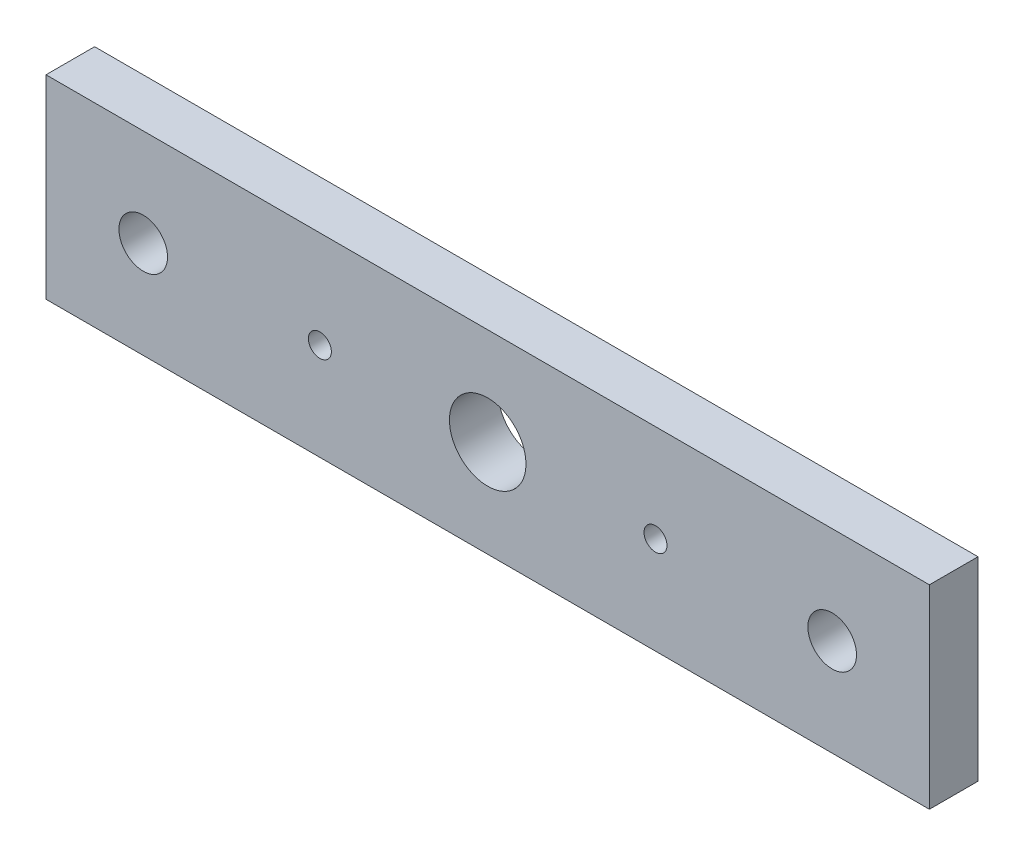
ISO-10303-21;
HEADER;
FILE_DESCRIPTION(('STEP AP214'),'2;1');
FILE_NAME('part.step','',(''),(''),'','','');
FILE_SCHEMA(('AUTOMOTIVE_DESIGN { 1 0 10303 214 1 1 1 1 }'));
ENDSEC;
DATA;
#1=APPLICATION_CONTEXT('core data for automotive mechanical design processes');
#2=APPLICATION_PROTOCOL_DEFINITION('international standard','automotive_design',2000,#1);
#3=PRODUCT_CONTEXT('',#1,'mechanical');
#4=PRODUCT('Part','Part','',(#3));
#5=PRODUCT_RELATED_PRODUCT_CATEGORY('part','',(#4));
#6=PRODUCT_DEFINITION_FORMATION('','',#4);
#7=PRODUCT_DEFINITION_CONTEXT('part definition',#1,'design');
#8=PRODUCT_DEFINITION('design','',#6,#7);
#9=PRODUCT_DEFINITION_SHAPE('','',#8);
#10=(LENGTH_UNIT() NAMED_UNIT(*) SI_UNIT(.MILLI.,.METRE.));
#11=(NAMED_UNIT(*) PLANE_ANGLE_UNIT() SI_UNIT($,.RADIAN.));
#12=(NAMED_UNIT(*) SI_UNIT($,.STERADIAN.) SOLID_ANGLE_UNIT());
#13=UNCERTAINTY_MEASURE_WITH_UNIT(LENGTH_MEASURE(1.E-05),#10,'distance_accuracy_value','');
#14=(GEOMETRIC_REPRESENTATION_CONTEXT(3) GLOBAL_UNCERTAINTY_ASSIGNED_CONTEXT((#13)) GLOBAL_UNIT_ASSIGNED_CONTEXT((#10,
#11,#12)) REPRESENTATION_CONTEXT('',''));
#15=CARTESIAN_POINT('',(0.,0.,0.));
#16=DIRECTION('',(0.,0.,1.));
#17=DIRECTION('',(1.,0.,0.));
#18=AXIS2_PLACEMENT_3D('',#15,#16,#17);
#19=CARTESIAN_POINT('',(115.4,0.,0.));
#20=DIRECTION('',(0.,0.,-1.));
#21=DIRECTION('',(-1.,0.,0.));
#22=AXIS2_PLACEMENT_3D('',#19,#20,#21);
#23=PLANE('',#22);
#24=CARTESIAN_POINT('',(102.7,12.7,0.));
#25=DIRECTION('',(0.,0.,1.));
#26=DIRECTION('',(1.,0.,0.));
#27=AXIS2_PLACEMENT_3D('',#24,#25,#26);
#28=CIRCLE('',#27,3.175);
#29=CARTESIAN_POINT('',(105.875,12.7,0.));
#30=VERTEX_POINT('',#29);
#31=EDGE_CURVE('E133',#30,#30,#28,.T.);
#32=ORIENTED_EDGE('',*,*,#31,.F.);
#33=EDGE_LOOP('',(#32));
#34=FACE_BOUND('',#33,.T.);
#35=CARTESIAN_POINT('',(79.620310216783,12.7,0.));
#36=DIRECTION('',(0.,0.,1.));
#37=DIRECTION('',(1.,0.,0.));
#38=AXIS2_PLACEMENT_3D('',#35,#36,#37);
#39=CIRCLE('',#38,1.5);
#40=CARTESIAN_POINT('',(81.120310216783,12.7,0.));
#41=VERTEX_POINT('',#40);
#42=EDGE_CURVE('E127',#41,#41,#39,.T.);
#43=ORIENTED_EDGE('',*,*,#42,.F.);
#44=EDGE_LOOP('',(#43));
#45=FACE_BOUND('',#44,.T.);
#46=CARTESIAN_POINT('',(12.7,12.7,0.));
#47=DIRECTION('',(0.,0.,1.));
#48=DIRECTION('',(1.,0.,0.));
#49=AXIS2_PLACEMENT_3D('',#46,#47,#48);
#50=CIRCLE('',#49,3.175);
#51=CARTESIAN_POINT('',(15.875,12.7,0.));
#52=VERTEX_POINT('',#51);
#53=EDGE_CURVE('E121',#52,#52,#50,.T.);
#54=ORIENTED_EDGE('',*,*,#53,.F.);
#55=EDGE_LOOP('',(#54));
#56=FACE_BOUND('',#55,.T.);
#57=CARTESIAN_POINT('',(35.779689783217,12.7,0.));
#58=DIRECTION('',(0.,0.,1.));
#59=DIRECTION('',(1.,0.,0.));
#60=AXIS2_PLACEMENT_3D('',#57,#58,#59);
#61=CIRCLE('',#60,1.5);
#62=CARTESIAN_POINT('',(37.279689783217,12.7,0.));
#63=VERTEX_POINT('',#62);
#64=EDGE_CURVE('E115',#63,#63,#61,.T.);
#65=ORIENTED_EDGE('',*,*,#64,.F.);
#66=EDGE_LOOP('',(#65));
#67=FACE_BOUND('',#66,.T.);
#68=CARTESIAN_POINT('',(57.7,12.7,0.));
#69=DIRECTION('',(0.,0.,1.));
#70=DIRECTION('',(1.,0.,0.));
#71=AXIS2_PLACEMENT_3D('',#68,#69,#70);
#72=CIRCLE('',#71,5.);
#73=CARTESIAN_POINT('',(62.7,12.7,0.));
#74=VERTEX_POINT('',#73);
#75=EDGE_CURVE('E109',#74,#74,#72,.T.);
#76=ORIENTED_EDGE('',*,*,#75,.F.);
#77=EDGE_LOOP('',(#76));
#78=FACE_BOUND('',#77,.T.);
#79=DIRECTION('',(0.,-1.,0.));
#80=VECTOR('',#79,1.);
#81=CARTESIAN_POINT('',(0.,0.,0.));
#82=LINE('',#81,#80);
#83=CARTESIAN_POINT('',(0.,25.4,0.));
#84=VERTEX_POINT('',#83);
#85=CARTESIAN_POINT('',(0.,0.,0.));
#86=VERTEX_POINT('',#85);
#87=EDGE_CURVE('E95',#84,#86,#82,.T.);
#88=ORIENTED_EDGE('',*,*,#87,.T.);
#89=DIRECTION('',(-1.,0.,0.));
#90=VECTOR('',#89,1.);
#91=CARTESIAN_POINT('',(115.4,0.,0.));
#92=LINE('',#91,#90);
#93=CARTESIAN_POINT('',(115.4,0.,0.));
#94=VERTEX_POINT('',#93);
#95=EDGE_CURVE('E11',#94,#86,#92,.T.);
#96=ORIENTED_EDGE('',*,*,#95,.F.);
#97=DIRECTION('',(0.,-1.,0.));
#98=VECTOR('',#97,1.);
#99=CARTESIAN_POINT('',(115.4,0.,0.));
#100=LINE('',#99,#98);
#101=CARTESIAN_POINT('',(115.4,25.4,0.));
#102=VERTEX_POINT('',#101);
#103=EDGE_CURVE('E83',#102,#94,#100,.T.);
#104=ORIENTED_EDGE('',*,*,#103,.F.);
#105=DIRECTION('',(-1.,0.,0.));
#106=VECTOR('',#105,1.);
#107=CARTESIAN_POINT('',(115.4,25.4,0.));
#108=LINE('',#107,#106);
#109=EDGE_CURVE('E91',#102,#84,#108,.T.);
#110=ORIENTED_EDGE('',*,*,#109,.T.);
#111=EDGE_LOOP('',(#88,#96,#104,#110));
#112=FACE_BOUND('',#111,.T.);
#113=ADVANCED_FACE('F32',(#34,#45,#56,#67,#78,#112),#23,.F.);
#114=CARTESIAN_POINT('',(115.4,0.,0.));
#115=DIRECTION('',(0.,1.,0.));
#116=DIRECTION('',(0.,0.,1.));
#117=AXIS2_PLACEMENT_3D('',#114,#115,#116);
#118=PLANE('',#117);
#119=DIRECTION('',(0.,0.,-1.));
#120=VECTOR('',#119,1.);
#121=CARTESIAN_POINT('',(0.,0.,0.));
#122=LINE('',#121,#120);
#123=CARTESIAN_POINT('',(0.,0.,-6.35));
#124=VERTEX_POINT('',#123);
#125=EDGE_CURVE('E87',#86,#124,#122,.T.);
#126=ORIENTED_EDGE('',*,*,#125,.T.);
#127=DIRECTION('',(-1.,0.,0.));
#128=VECTOR('',#127,1.);
#129=CARTESIAN_POINT('',(115.4,0.,-6.35));
#130=LINE('',#129,#128);
#131=CARTESIAN_POINT('',(115.4,0.,-6.35));
#132=VERTEX_POINT('',#131);
#133=EDGE_CURVE('E40',#132,#124,#130,.T.);
#134=ORIENTED_EDGE('',*,*,#133,.F.);
#135=DIRECTION('',(0.,0.,-1.));
#136=VECTOR('',#135,1.);
#137=CARTESIAN_POINT('',(115.4,0.,0.));
#138=LINE('',#137,#136);
#139=EDGE_CURVE('E78',#94,#132,#138,.T.);
#140=ORIENTED_EDGE('',*,*,#139,.F.);
#141=ORIENTED_EDGE('',*,*,#95,.T.);
#142=EDGE_LOOP('',(#126,#134,#140,#141));
#143=FACE_BOUND('',#142,.T.);
#144=ADVANCED_FACE('F86',(#143),#118,.F.);
#145=CARTESIAN_POINT('',(115.4,0.,-6.35));
#146=DIRECTION('',(0.,0.,1.));
#147=DIRECTION('',(0.,-1.,0.));
#148=AXIS2_PLACEMENT_3D('',#145,#146,#147);
#149=PLANE('',#148);
#150=CARTESIAN_POINT('',(102.7,12.7,-6.35));
#151=DIRECTION('',(0.,0.,1.));
#152=DIRECTION('',(1.,0.,0.));
#153=AXIS2_PLACEMENT_3D('',#150,#151,#152);
#154=CIRCLE('',#153,3.175);
#155=CARTESIAN_POINT('',(105.875,12.7,-6.35));
#156=VERTEX_POINT('',#155);
#157=EDGE_CURVE('E130',#156,#156,#154,.T.);
#158=ORIENTED_EDGE('',*,*,#157,.T.);
#159=EDGE_LOOP('',(#158));
#160=FACE_BOUND('',#159,.T.);
#161=CARTESIAN_POINT('',(79.620310216783,12.7,-6.35));
#162=DIRECTION('',(0.,0.,1.));
#163=DIRECTION('',(1.,0.,0.));
#164=AXIS2_PLACEMENT_3D('',#161,#162,#163);
#165=CIRCLE('',#164,1.5);
#166=CARTESIAN_POINT('',(81.120310216783,12.7,-6.35));
#167=VERTEX_POINT('',#166);
#168=EDGE_CURVE('E124',#167,#167,#165,.T.);
#169=ORIENTED_EDGE('',*,*,#168,.T.);
#170=EDGE_LOOP('',(#169));
#171=FACE_BOUND('',#170,.T.);
#172=CARTESIAN_POINT('',(12.7,12.7,-6.35));
#173=DIRECTION('',(0.,0.,1.));
#174=DIRECTION('',(1.,0.,0.));
#175=AXIS2_PLACEMENT_3D('',#172,#173,#174);
#176=CIRCLE('',#175,3.175);
#177=CARTESIAN_POINT('',(15.875,12.7,-6.35));
#178=VERTEX_POINT('',#177);
#179=EDGE_CURVE('E118',#178,#178,#176,.T.);
#180=ORIENTED_EDGE('',*,*,#179,.T.);
#181=EDGE_LOOP('',(#180));
#182=FACE_BOUND('',#181,.T.);
#183=CARTESIAN_POINT('',(35.779689783217,12.7,-6.35));
#184=DIRECTION('',(0.,0.,1.));
#185=DIRECTION('',(1.,0.,0.));
#186=AXIS2_PLACEMENT_3D('',#183,#184,#185);
#187=CIRCLE('',#186,1.5);
#188=CARTESIAN_POINT('',(37.279689783217,12.7,-6.35));
#189=VERTEX_POINT('',#188);
#190=EDGE_CURVE('E112',#189,#189,#187,.T.);
#191=ORIENTED_EDGE('',*,*,#190,.T.);
#192=EDGE_LOOP('',(#191));
#193=FACE_BOUND('',#192,.T.);
#194=CARTESIAN_POINT('',(57.7,12.7,-6.35));
#195=DIRECTION('',(0.,0.,1.));
#196=DIRECTION('',(1.,0.,0.));
#197=AXIS2_PLACEMENT_3D('',#194,#195,#196);
#198=CIRCLE('',#197,5.);
#199=CARTESIAN_POINT('',(62.7,12.7,-6.35));
#200=VERTEX_POINT('',#199);
#201=EDGE_CURVE('E98',#200,#200,#198,.T.);
#202=ORIENTED_EDGE('',*,*,#201,.T.);
#203=EDGE_LOOP('',(#202));
#204=FACE_BOUND('',#203,.T.);
#205=DIRECTION('',(0.,1.,0.));
#206=VECTOR('',#205,1.);
#207=CARTESIAN_POINT('',(0.,0.,-6.35));
#208=LINE('',#207,#206);
#209=CARTESIAN_POINT('',(0.,25.4,-6.35));
#210=VERTEX_POINT('',#209);
#211=EDGE_CURVE('E65',#124,#210,#208,.T.);
#212=ORIENTED_EDGE('',*,*,#211,.T.);
#213=DIRECTION('',(-1.,0.,0.));
#214=VECTOR('',#213,1.);
#215=CARTESIAN_POINT('',(115.4,25.4,-6.35));
#216=LINE('',#215,#214);
#217=CARTESIAN_POINT('',(115.4,25.4,-6.35));
#218=VERTEX_POINT('',#217);
#219=EDGE_CURVE('E88',#218,#210,#216,.T.);
#220=ORIENTED_EDGE('',*,*,#219,.F.);
#221=DIRECTION('',(0.,1.,0.));
#222=VECTOR('',#221,1.);
#223=CARTESIAN_POINT('',(115.4,0.,-6.35));
#224=LINE('',#223,#222);
#225=EDGE_CURVE('E81',#132,#218,#224,.T.);
#226=ORIENTED_EDGE('',*,*,#225,.F.);
#227=ORIENTED_EDGE('',*,*,#133,.T.);
#228=EDGE_LOOP('',(#212,#220,#226,#227));
#229=FACE_BOUND('',#228,.T.);
#230=ADVANCED_FACE('F89',(#160,#171,#182,#193,#204,#229),#149,.F.);
#231=CARTESIAN_POINT('',(115.4,25.4,0.));
#232=DIRECTION('',(0.,-1.,0.));
#233=DIRECTION('',(0.,0.,-1.));
#234=AXIS2_PLACEMENT_3D('',#231,#232,#233);
#235=PLANE('',#234);
#236=DIRECTION('',(0.,0.,1.));
#237=VECTOR('',#236,1.);
#238=CARTESIAN_POINT('',(0.,25.4,0.));
#239=LINE('',#238,#237);
#240=EDGE_CURVE('E71',#210,#84,#239,.T.);
#241=ORIENTED_EDGE('',*,*,#240,.T.);
#242=ORIENTED_EDGE('',*,*,#109,.F.);
#243=DIRECTION('',(0.,0.,1.));
#244=VECTOR('',#243,1.);
#245=CARTESIAN_POINT('',(115.4,25.4,0.));
#246=LINE('',#245,#244);
#247=EDGE_CURVE('E48',#218,#102,#246,.T.);
#248=ORIENTED_EDGE('',*,*,#247,.F.);
#249=ORIENTED_EDGE('',*,*,#219,.T.);
#250=EDGE_LOOP('',(#241,#242,#248,#249));
#251=FACE_BOUND('',#250,.T.);
#252=ADVANCED_FACE('F103',(#251),#235,.F.);
#253=CARTESIAN_POINT('',(115.4,0.,0.));
#254=DIRECTION('',(-1.,0.,0.));
#255=DIRECTION('',(0.,0.,1.));
#256=AXIS2_PLACEMENT_3D('',#253,#254,#255);
#257=PLANE('',#256);
#258=ORIENTED_EDGE('',*,*,#103,.T.);
#259=ORIENTED_EDGE('',*,*,#139,.T.);
#260=ORIENTED_EDGE('',*,*,#225,.T.);
#261=ORIENTED_EDGE('',*,*,#247,.T.);
#262=EDGE_LOOP('',(#258,#259,#260,#261));
#263=FACE_BOUND('',#262,.T.);
#264=ADVANCED_FACE('F79',(#263),#257,.F.);
#265=CARTESIAN_POINT('',(0.,0.,0.));
#266=DIRECTION('',(-1.,0.,0.));
#267=DIRECTION('',(0.,0.,1.));
#268=AXIS2_PLACEMENT_3D('',#265,#266,#267);
#269=PLANE('',#268);
#270=ORIENTED_EDGE('',*,*,#87,.F.);
#271=ORIENTED_EDGE('',*,*,#240,.F.);
#272=ORIENTED_EDGE('',*,*,#211,.F.);
#273=ORIENTED_EDGE('',*,*,#125,.F.);
#274=EDGE_LOOP('',(#270,#271,#272,#273));
#275=FACE_BOUND('',#274,.T.);
#276=ADVANCED_FACE('F106',(#275),#269,.T.);
#277=CARTESIAN_POINT('',(57.7,12.7,-6.35));
#278=DIRECTION('',(0.,0.,1.));
#279=DIRECTION('',(1.,0.,0.));
#280=AXIS2_PLACEMENT_3D('',#277,#278,#279);
#281=CYLINDRICAL_SURFACE('',#280,5.);
#282=ORIENTED_EDGE('',*,*,#201,.F.);
#283=EDGE_LOOP('',(#282));
#284=FACE_BOUND('',#283,.T.);
#285=ORIENTED_EDGE('',*,*,#75,.T.);
#286=EDGE_LOOP('',(#285));
#287=FACE_BOUND('',#286,.T.);
#288=ADVANCED_FACE('F158',(#284,#287),#281,.F.);
#289=CARTESIAN_POINT('',(35.779689783217,12.7,-6.35));
#290=DIRECTION('',(0.,0.,1.));
#291=DIRECTION('',(1.,0.,0.));
#292=AXIS2_PLACEMENT_3D('',#289,#290,#291);
#293=CYLINDRICAL_SURFACE('',#292,1.5);
#294=ORIENTED_EDGE('',*,*,#190,.F.);
#295=EDGE_LOOP('',(#294));
#296=FACE_BOUND('',#295,.T.);
#297=ORIENTED_EDGE('',*,*,#64,.T.);
#298=EDGE_LOOP('',(#297));
#299=FACE_BOUND('',#298,.T.);
#300=ADVANCED_FACE('F160',(#296,#299),#293,.F.);
#301=CARTESIAN_POINT('',(12.7,12.7,-6.35));
#302=DIRECTION('',(0.,0.,1.));
#303=DIRECTION('',(1.,0.,0.));
#304=AXIS2_PLACEMENT_3D('',#301,#302,#303);
#305=CYLINDRICAL_SURFACE('',#304,3.175);
#306=ORIENTED_EDGE('',*,*,#179,.F.);
#307=EDGE_LOOP('',(#306));
#308=FACE_BOUND('',#307,.T.);
#309=ORIENTED_EDGE('',*,*,#53,.T.);
#310=EDGE_LOOP('',(#309));
#311=FACE_BOUND('',#310,.T.);
#312=ADVANCED_FACE('F167',(#308,#311),#305,.F.);
#313=CARTESIAN_POINT('',(79.620310216783,12.7,-6.35));
#314=DIRECTION('',(0.,0.,1.));
#315=DIRECTION('',(1.,0.,0.));
#316=AXIS2_PLACEMENT_3D('',#313,#314,#315);
#317=CYLINDRICAL_SURFACE('',#316,1.5);
#318=ORIENTED_EDGE('',*,*,#168,.F.);
#319=EDGE_LOOP('',(#318));
#320=FACE_BOUND('',#319,.T.);
#321=ORIENTED_EDGE('',*,*,#42,.T.);
#322=EDGE_LOOP('',(#321));
#323=FACE_BOUND('',#322,.T.);
#324=ADVANCED_FACE('F144',(#320,#323),#317,.F.);
#325=CARTESIAN_POINT('',(102.7,12.7,-6.35));
#326=DIRECTION('',(0.,0.,1.));
#327=DIRECTION('',(1.,0.,0.));
#328=AXIS2_PLACEMENT_3D('',#325,#326,#327);
#329=CYLINDRICAL_SURFACE('',#328,3.175);
#330=ORIENTED_EDGE('',*,*,#157,.F.);
#331=EDGE_LOOP('',(#330));
#332=FACE_BOUND('',#331,.T.);
#333=ORIENTED_EDGE('',*,*,#31,.T.);
#334=EDGE_LOOP('',(#333));
#335=FACE_BOUND('',#334,.T.);
#336=ADVANCED_FACE('F141',(#332,#335),#329,.F.);
#337=CLOSED_SHELL('',(#113,#144,#230,#252,#264,#276,#288,#300,#312,#324,#336));
#338=MANIFOLD_SOLID_BREP('B2',#337);
#339=ADVANCED_BREP_SHAPE_REPRESENTATION('',(#18,#338),#14);
#340=SHAPE_DEFINITION_REPRESENTATION(#9,#339);
ENDSEC;
END-ISO-10303-21;
